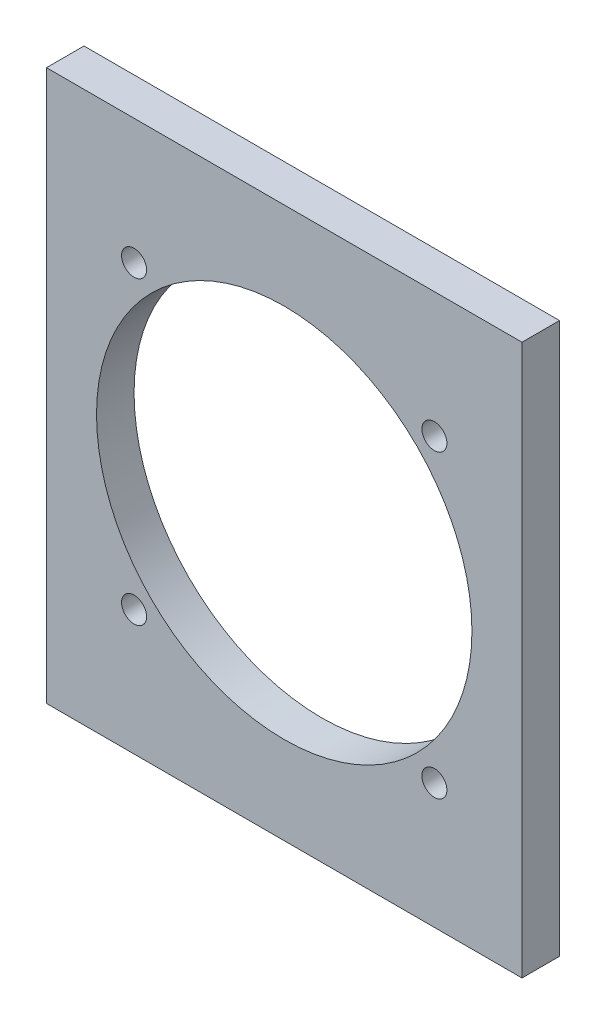
ISO-10303-21;
HEADER;
FILE_DESCRIPTION(('STEP AP214'),'2;1');
FILE_NAME('part.step','',(''),(''),'','','');
FILE_SCHEMA(('AUTOMOTIVE_DESIGN { 1 0 10303 214 1 1 1 1 }'));
ENDSEC;
DATA;
#1=APPLICATION_CONTEXT('core data for automotive mechanical design processes');
#2=APPLICATION_PROTOCOL_DEFINITION('international standard','automotive_design',2000,#1);
#3=PRODUCT_CONTEXT('',#1,'mechanical');
#4=PRODUCT('Part','Part','',(#3));
#5=PRODUCT_RELATED_PRODUCT_CATEGORY('part','',(#4));
#6=PRODUCT_DEFINITION_FORMATION('','',#4);
#7=PRODUCT_DEFINITION_CONTEXT('part definition',#1,'design');
#8=PRODUCT_DEFINITION('design','',#6,#7);
#9=PRODUCT_DEFINITION_SHAPE('','',#8);
#10=(LENGTH_UNIT() NAMED_UNIT(*) SI_UNIT(.MILLI.,.METRE.));
#11=(NAMED_UNIT(*) PLANE_ANGLE_UNIT() SI_UNIT($,.RADIAN.));
#12=(NAMED_UNIT(*) SI_UNIT($,.STERADIAN.) SOLID_ANGLE_UNIT());
#13=UNCERTAINTY_MEASURE_WITH_UNIT(LENGTH_MEASURE(1.E-05),#10,'distance_accuracy_value','');
#14=(GEOMETRIC_REPRESENTATION_CONTEXT(3) GLOBAL_UNCERTAINTY_ASSIGNED_CONTEXT((#13)) GLOBAL_UNIT_ASSIGNED_CONTEXT((#10,
#11,#12)) REPRESENTATION_CONTEXT('',''));
#15=CARTESIAN_POINT('',(0.,0.,0.));
#16=DIRECTION('',(0.,0.,1.));
#17=DIRECTION('',(1.,0.,0.));
#18=AXIS2_PLACEMENT_3D('',#15,#16,#17);
#19=CARTESIAN_POINT('',(95.,-110.,15.));
#20=DIRECTION('',(-1.,0.,0.));
#21=DIRECTION('',(0.,0.,1.));
#22=AXIS2_PLACEMENT_3D('',#19,#20,#21);
#23=PLANE('',#22);
#24=DIRECTION('',(0.,1.,0.));
#25=VECTOR('',#24,1.);
#26=CARTESIAN_POINT('',(95.,-110.,0.));
#27=LINE('',#26,#25);
#28=CARTESIAN_POINT('',(95.,-110.,0.));
#29=VERTEX_POINT('',#28);
#30=CARTESIAN_POINT('',(95.,110.,0.));
#31=VERTEX_POINT('',#30);
#32=EDGE_CURVE('E102',#29,#31,#27,.T.);
#33=ORIENTED_EDGE('',*,*,#32,.T.);
#34=DIRECTION('',(0.,0.,-1.));
#35=VECTOR('',#34,1.);
#36=CARTESIAN_POINT('',(95.,110.,15.));
#37=LINE('',#36,#35);
#38=CARTESIAN_POINT('',(95.,110.,15.));
#39=VERTEX_POINT('',#38);
#40=EDGE_CURVE('E11',#39,#31,#37,.T.);
#41=ORIENTED_EDGE('',*,*,#40,.F.);
#42=DIRECTION('',(0.,1.,0.));
#43=VECTOR('',#42,1.);
#44=CARTESIAN_POINT('',(95.,-110.,15.));
#45=LINE('',#44,#43);
#46=CARTESIAN_POINT('',(95.,-110.,15.));
#47=VERTEX_POINT('',#46);
#48=EDGE_CURVE('E90',#47,#39,#45,.T.);
#49=ORIENTED_EDGE('',*,*,#48,.F.);
#50=DIRECTION('',(0.,0.,-1.));
#51=VECTOR('',#50,1.);
#52=CARTESIAN_POINT('',(95.,-110.,15.));
#53=LINE('',#52,#51);
#54=EDGE_CURVE('E98',#47,#29,#53,.T.);
#55=ORIENTED_EDGE('',*,*,#54,.T.);
#56=EDGE_LOOP('',(#33,#41,#49,#55));
#57=FACE_BOUND('',#56,.T.);
#58=ADVANCED_FACE('F39',(#57),#23,.F.);
#59=CARTESIAN_POINT('',(-95.,110.,15.));
#60=DIRECTION('',(0.,-1.,0.));
#61=DIRECTION('',(0.,0.,-1.));
#62=AXIS2_PLACEMENT_3D('',#59,#60,#61);
#63=PLANE('',#62);
#64=DIRECTION('',(-1.,0.,0.));
#65=VECTOR('',#64,1.);
#66=CARTESIAN_POINT('',(-95.,110.,0.));
#67=LINE('',#66,#65);
#68=CARTESIAN_POINT('',(-95.,110.,0.));
#69=VERTEX_POINT('',#68);
#70=EDGE_CURVE('E94',#31,#69,#67,.T.);
#71=ORIENTED_EDGE('',*,*,#70,.T.);
#72=DIRECTION('',(0.,0.,-1.));
#73=VECTOR('',#72,1.);
#74=CARTESIAN_POINT('',(-95.,110.,15.));
#75=LINE('',#74,#73);
#76=CARTESIAN_POINT('',(-95.,110.,15.));
#77=VERTEX_POINT('',#76);
#78=EDGE_CURVE('E47',#77,#69,#75,.T.);
#79=ORIENTED_EDGE('',*,*,#78,.F.);
#80=DIRECTION('',(-1.,0.,0.));
#81=VECTOR('',#80,1.);
#82=CARTESIAN_POINT('',(-95.,110.,15.));
#83=LINE('',#82,#81);
#84=EDGE_CURVE('E85',#39,#77,#83,.T.);
#85=ORIENTED_EDGE('',*,*,#84,.F.);
#86=ORIENTED_EDGE('',*,*,#40,.T.);
#87=EDGE_LOOP('',(#71,#79,#85,#86));
#88=FACE_BOUND('',#87,.T.);
#89=ADVANCED_FACE('F93',(#88),#63,.F.);
#90=CARTESIAN_POINT('',(-95.,-110.,15.));
#91=DIRECTION('',(1.,0.,0.));
#92=DIRECTION('',(0.,0.,-1.));
#93=AXIS2_PLACEMENT_3D('',#90,#91,#92);
#94=PLANE('',#93);
#95=DIRECTION('',(0.,-1.,0.));
#96=VECTOR('',#95,1.);
#97=CARTESIAN_POINT('',(-95.,-110.,0.));
#98=LINE('',#97,#96);
#99=CARTESIAN_POINT('',(-95.,-110.,0.));
#100=VERTEX_POINT('',#99);
#101=EDGE_CURVE('E72',#69,#100,#98,.T.);
#102=ORIENTED_EDGE('',*,*,#101,.T.);
#103=DIRECTION('',(0.,0.,-1.));
#104=VECTOR('',#103,1.);
#105=CARTESIAN_POINT('',(-95.,-110.,15.));
#106=LINE('',#105,#104);
#107=CARTESIAN_POINT('',(-95.,-110.,15.));
#108=VERTEX_POINT('',#107);
#109=EDGE_CURVE('E95',#108,#100,#106,.T.);
#110=ORIENTED_EDGE('',*,*,#109,.F.);
#111=DIRECTION('',(0.,-1.,0.));
#112=VECTOR('',#111,1.);
#113=CARTESIAN_POINT('',(-95.,-110.,15.));
#114=LINE('',#113,#112);
#115=EDGE_CURVE('E88',#77,#108,#114,.T.);
#116=ORIENTED_EDGE('',*,*,#115,.F.);
#117=ORIENTED_EDGE('',*,*,#78,.T.);
#118=EDGE_LOOP('',(#102,#110,#116,#117));
#119=FACE_BOUND('',#118,.T.);
#120=ADVANCED_FACE('F96',(#119),#94,.F.);
#121=CARTESIAN_POINT('',(-95.,-110.,15.));
#122=DIRECTION('',(0.,1.,0.));
#123=DIRECTION('',(0.,0.,1.));
#124=AXIS2_PLACEMENT_3D('',#121,#122,#123);
#125=PLANE('',#124);
#126=DIRECTION('',(1.,0.,0.));
#127=VECTOR('',#126,1.);
#128=CARTESIAN_POINT('',(-95.,-110.,0.));
#129=LINE('',#128,#127);
#130=EDGE_CURVE('E78',#100,#29,#129,.T.);
#131=ORIENTED_EDGE('',*,*,#130,.T.);
#132=ORIENTED_EDGE('',*,*,#54,.F.);
#133=DIRECTION('',(1.,0.,0.));
#134=VECTOR('',#133,1.);
#135=CARTESIAN_POINT('',(-95.,-110.,15.));
#136=LINE('',#135,#134);
#137=EDGE_CURVE('E55',#108,#47,#136,.T.);
#138=ORIENTED_EDGE('',*,*,#137,.F.);
#139=ORIENTED_EDGE('',*,*,#109,.T.);
#140=EDGE_LOOP('',(#131,#132,#138,#139));
#141=FACE_BOUND('',#140,.T.);
#142=ADVANCED_FACE('F110',(#141),#125,.F.);
#143=CARTESIAN_POINT('',(0.,0.,15.));
#144=DIRECTION('',(0.,0.,-1.));
#145=DIRECTION('',(-1.,0.,0.));
#146=AXIS2_PLACEMENT_3D('',#143,#144,#145);
#147=PLANE('',#146);
#148=CARTESIAN_POINT('',(-60.,-60.,15.));
#149=DIRECTION('',(0.,0.,1.));
#150=DIRECTION('',(1.,0.,0.));
#151=AXIS2_PLACEMENT_3D('',#148,#149,#150);
#152=CIRCLE('',#151,5.);
#153=CARTESIAN_POINT('',(-55.,-60.,15.));
#154=VERTEX_POINT('',#153);
#155=EDGE_CURVE('E122',#154,#154,#152,.T.);
#156=ORIENTED_EDGE('',*,*,#155,.F.);
#157=EDGE_LOOP('',(#156));
#158=FACE_BOUND('',#157,.T.);
#159=CARTESIAN_POINT('',(60.,-60.,15.));
#160=DIRECTION('',(0.,0.,1.));
#161=DIRECTION('',(1.,0.,0.));
#162=AXIS2_PLACEMENT_3D('',#159,#160,#161);
#163=CIRCLE('',#162,5.);
#164=CARTESIAN_POINT('',(65.,-60.,15.));
#165=VERTEX_POINT('',#164);
#166=EDGE_CURVE('E129',#165,#165,#163,.T.);
#167=ORIENTED_EDGE('',*,*,#166,.F.);
#168=EDGE_LOOP('',(#167));
#169=FACE_BOUND('',#168,.T.);
#170=CARTESIAN_POINT('',(60.,60.,15.));
#171=DIRECTION('',(0.,0.,1.));
#172=DIRECTION('',(1.,0.,0.));
#173=AXIS2_PLACEMENT_3D('',#170,#171,#172);
#174=CIRCLE('',#173,5.);
#175=CARTESIAN_POINT('',(65.,60.,15.));
#176=VERTEX_POINT('',#175);
#177=EDGE_CURVE('E135',#176,#176,#174,.T.);
#178=ORIENTED_EDGE('',*,*,#177,.F.);
#179=EDGE_LOOP('',(#178));
#180=FACE_BOUND('',#179,.T.);
#181=CARTESIAN_POINT('',(-60.,60.,15.));
#182=DIRECTION('',(0.,0.,1.));
#183=DIRECTION('',(1.,0.,0.));
#184=AXIS2_PLACEMENT_3D('',#181,#182,#183);
#185=CIRCLE('',#184,5.);
#186=CARTESIAN_POINT('',(-55.,60.,15.));
#187=VERTEX_POINT('',#186);
#188=EDGE_CURVE('E121',#187,#187,#185,.T.);
#189=ORIENTED_EDGE('',*,*,#188,.F.);
#190=EDGE_LOOP('',(#189));
#191=FACE_BOUND('',#190,.T.);
#192=CARTESIAN_POINT('',(0.,0.,15.));
#193=DIRECTION('',(0.,0.,1.));
#194=DIRECTION('',(1.,0.,0.));
#195=AXIS2_PLACEMENT_3D('',#192,#193,#194);
#196=CIRCLE('',#195,75.);
#197=CARTESIAN_POINT('',(75.,0.,15.));
#198=VERTEX_POINT('',#197);
#199=EDGE_CURVE('E118',#198,#198,#196,.T.);
#200=ORIENTED_EDGE('',*,*,#199,.F.);
#201=EDGE_LOOP('',(#200));
#202=FACE_BOUND('',#201,.T.);
#203=ORIENTED_EDGE('',*,*,#48,.T.);
#204=ORIENTED_EDGE('',*,*,#84,.T.);
#205=ORIENTED_EDGE('',*,*,#115,.T.);
#206=ORIENTED_EDGE('',*,*,#137,.T.);
#207=EDGE_LOOP('',(#203,#204,#205,#206));
#208=FACE_BOUND('',#207,.T.);
#209=ADVANCED_FACE('F86',(#158,#169,#180,#191,#202,#208),#147,.F.);
#210=CARTESIAN_POINT('',(0.,0.,0.));
#211=DIRECTION('',(0.,0.,-1.));
#212=DIRECTION('',(-1.,0.,0.));
#213=AXIS2_PLACEMENT_3D('',#210,#211,#212);
#214=PLANE('',#213);
#215=CARTESIAN_POINT('',(-60.,-60.,0.));
#216=DIRECTION('',(0.,0.,-1.));
#217=DIRECTION('',(-1.,0.,0.));
#218=AXIS2_PLACEMENT_3D('',#215,#216,#217);
#219=CIRCLE('',#218,5.);
#220=CARTESIAN_POINT('',(-65.,-60.,0.));
#221=VERTEX_POINT('',#220);
#222=EDGE_CURVE('E126',#221,#221,#219,.F.);
#223=ORIENTED_EDGE('',*,*,#222,.T.);
#224=EDGE_LOOP('',(#223));
#225=FACE_BOUND('',#224,.T.);
#226=CARTESIAN_POINT('',(60.,-60.,0.));
#227=DIRECTION('',(0.,0.,-1.));
#228=DIRECTION('',(-1.,0.,0.));
#229=AXIS2_PLACEMENT_3D('',#226,#227,#228);
#230=CIRCLE('',#229,5.);
#231=CARTESIAN_POINT('',(55.,-60.,0.));
#232=VERTEX_POINT('',#231);
#233=EDGE_CURVE('E125',#232,#232,#230,.F.);
#234=ORIENTED_EDGE('',*,*,#233,.T.);
#235=EDGE_LOOP('',(#234));
#236=FACE_BOUND('',#235,.T.);
#237=CARTESIAN_POINT('',(60.,60.,0.));
#238=DIRECTION('',(0.,0.,-1.));
#239=DIRECTION('',(-1.,0.,0.));
#240=AXIS2_PLACEMENT_3D('',#237,#238,#239);
#241=CIRCLE('',#240,5.);
#242=CARTESIAN_POINT('',(55.,60.,0.));
#243=VERTEX_POINT('',#242);
#244=EDGE_CURVE('E132',#243,#243,#241,.F.);
#245=ORIENTED_EDGE('',*,*,#244,.T.);
#246=EDGE_LOOP('',(#245));
#247=FACE_BOUND('',#246,.T.);
#248=CARTESIAN_POINT('',(-60.,60.,0.));
#249=DIRECTION('',(0.,0.,-1.));
#250=DIRECTION('',(-1.,0.,0.));
#251=AXIS2_PLACEMENT_3D('',#248,#249,#250);
#252=CIRCLE('',#251,5.);
#253=CARTESIAN_POINT('',(-65.,60.,0.));
#254=VERTEX_POINT('',#253);
#255=EDGE_CURVE('E138',#254,#254,#252,.F.);
#256=ORIENTED_EDGE('',*,*,#255,.T.);
#257=EDGE_LOOP('',(#256));
#258=FACE_BOUND('',#257,.T.);
#259=CARTESIAN_POINT('',(0.,0.,0.));
#260=DIRECTION('',(0.,0.,-1.));
#261=DIRECTION('',(-1.,0.,0.));
#262=AXIS2_PLACEMENT_3D('',#259,#260,#261);
#263=CIRCLE('',#262,75.);
#264=CARTESIAN_POINT('',(-75.,0.,0.));
#265=VERTEX_POINT('',#264);
#266=EDGE_CURVE('E105',#265,#265,#263,.F.);
#267=ORIENTED_EDGE('',*,*,#266,.T.);
#268=EDGE_LOOP('',(#267));
#269=FACE_BOUND('',#268,.T.);
#270=ORIENTED_EDGE('',*,*,#32,.F.);
#271=ORIENTED_EDGE('',*,*,#130,.F.);
#272=ORIENTED_EDGE('',*,*,#101,.F.);
#273=ORIENTED_EDGE('',*,*,#70,.F.);
#274=EDGE_LOOP('',(#270,#271,#272,#273));
#275=FACE_BOUND('',#274,.T.);
#276=ADVANCED_FACE('F113',(#225,#236,#247,#258,#269,#275),#214,.T.);
#277=CARTESIAN_POINT('',(0.,0.,-212.132034355964));
#278=DIRECTION('',(0.,0.,1.));
#279=DIRECTION('',(1.,0.,0.));
#280=AXIS2_PLACEMENT_3D('',#277,#278,#279);
#281=CYLINDRICAL_SURFACE('',#280,75.);
#282=ORIENTED_EDGE('',*,*,#199,.T.);
#283=EDGE_LOOP('',(#282));
#284=FACE_BOUND('',#283,.T.);
#285=ORIENTED_EDGE('',*,*,#266,.F.);
#286=EDGE_LOOP('',(#285));
#287=FACE_BOUND('',#286,.T.);
#288=ADVANCED_FACE('F151',(#284,#287),#281,.F.);
#289=CARTESIAN_POINT('',(-60.,60.,-212.132034355964));
#290=DIRECTION('',(0.,0.,1.));
#291=DIRECTION('',(1.,0.,0.));
#292=AXIS2_PLACEMENT_3D('',#289,#290,#291);
#293=CYLINDRICAL_SURFACE('',#292,5.);
#294=ORIENTED_EDGE('',*,*,#188,.T.);
#295=EDGE_LOOP('',(#294));
#296=FACE_BOUND('',#295,.T.);
#297=ORIENTED_EDGE('',*,*,#255,.F.);
#298=EDGE_LOOP('',(#297));
#299=FACE_BOUND('',#298,.T.);
#300=ADVANCED_FACE('F148',(#296,#299),#293,.F.);
#301=CARTESIAN_POINT('',(60.,60.,-212.132034355964));
#302=DIRECTION('',(0.,0.,1.));
#303=DIRECTION('',(1.,0.,0.));
#304=AXIS2_PLACEMENT_3D('',#301,#302,#303);
#305=CYLINDRICAL_SURFACE('',#304,5.);
#306=ORIENTED_EDGE('',*,*,#177,.T.);
#307=EDGE_LOOP('',(#306));
#308=FACE_BOUND('',#307,.T.);
#309=ORIENTED_EDGE('',*,*,#244,.F.);
#310=EDGE_LOOP('',(#309));
#311=FACE_BOUND('',#310,.T.);
#312=ADVANCED_FACE('F150',(#308,#311),#305,.F.);
#313=CARTESIAN_POINT('',(60.,-60.,-212.132034355964));
#314=DIRECTION('',(0.,0.,1.));
#315=DIRECTION('',(1.,0.,0.));
#316=AXIS2_PLACEMENT_3D('',#313,#314,#315);
#317=CYLINDRICAL_SURFACE('',#316,5.);
#318=ORIENTED_EDGE('',*,*,#166,.T.);
#319=EDGE_LOOP('',(#318));
#320=FACE_BOUND('',#319,.T.);
#321=ORIENTED_EDGE('',*,*,#233,.F.);
#322=EDGE_LOOP('',(#321));
#323=FACE_BOUND('',#322,.T.);
#324=ADVANCED_FACE('F158',(#320,#323),#317,.F.);
#325=CARTESIAN_POINT('',(-60.,-60.,-212.132034355964));
#326=DIRECTION('',(0.,0.,1.));
#327=DIRECTION('',(1.,0.,0.));
#328=AXIS2_PLACEMENT_3D('',#325,#326,#327);
#329=CYLINDRICAL_SURFACE('',#328,5.);
#330=ORIENTED_EDGE('',*,*,#155,.T.);
#331=EDGE_LOOP('',(#330));
#332=FACE_BOUND('',#331,.T.);
#333=ORIENTED_EDGE('',*,*,#222,.F.);
#334=EDGE_LOOP('',(#333));
#335=FACE_BOUND('',#334,.T.);
#336=ADVANCED_FACE('F180',(#332,#335),#329,.F.);
#337=CLOSED_SHELL('',(#58,#89,#120,#142,#209,#276,#288,#300,#312,#324,#336));
#338=MANIFOLD_SOLID_BREP('B2',#337);
#339=ADVANCED_BREP_SHAPE_REPRESENTATION('',(#18,#338),#14);
#340=SHAPE_DEFINITION_REPRESENTATION(#9,#339);
ENDSEC;
END-ISO-10303-21;
